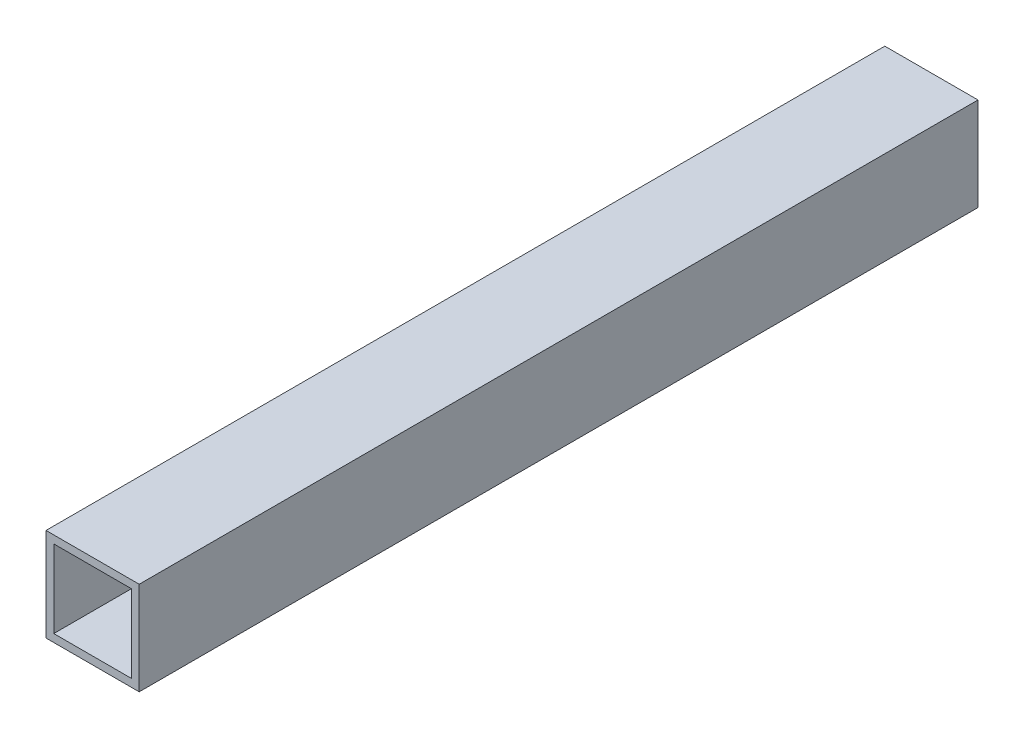
ISO-10303-21;
HEADER;
FILE_DESCRIPTION(('STEP AP214'),'2;1');
FILE_NAME('part.step','',(''),(''),'','','');
FILE_SCHEMA(('AUTOMOTIVE_DESIGN { 1 0 10303 214 1 1 1 1 }'));
ENDSEC;
DATA;
#1=APPLICATION_CONTEXT('core data for automotive mechanical design processes');
#2=APPLICATION_PROTOCOL_DEFINITION('international standard','automotive_design',2000,#1);
#3=PRODUCT_CONTEXT('',#1,'mechanical');
#4=PRODUCT('Part','Part','',(#3));
#5=PRODUCT_RELATED_PRODUCT_CATEGORY('part','',(#4));
#6=PRODUCT_DEFINITION_FORMATION('','',#4);
#7=PRODUCT_DEFINITION_CONTEXT('part definition',#1,'design');
#8=PRODUCT_DEFINITION('design','',#6,#7);
#9=PRODUCT_DEFINITION_SHAPE('','',#8);
#10=(LENGTH_UNIT() NAMED_UNIT(*) SI_UNIT(.MILLI.,.METRE.));
#11=(NAMED_UNIT(*) PLANE_ANGLE_UNIT() SI_UNIT($,.RADIAN.));
#12=(NAMED_UNIT(*) SI_UNIT($,.STERADIAN.) SOLID_ANGLE_UNIT());
#13=UNCERTAINTY_MEASURE_WITH_UNIT(LENGTH_MEASURE(1.E-05),#10,'distance_accuracy_value','');
#14=(GEOMETRIC_REPRESENTATION_CONTEXT(3) GLOBAL_UNCERTAINTY_ASSIGNED_CONTEXT((#13)) GLOBAL_UNIT_ASSIGNED_CONTEXT((#10,
#11,#12)) REPRESENTATION_CONTEXT('',''));
#15=CARTESIAN_POINT('',(0.,0.,0.));
#16=DIRECTION('',(0.,0.,1.));
#17=DIRECTION('',(1.,0.,0.));
#18=AXIS2_PLACEMENT_3D('',#15,#16,#17);
#19=CARTESIAN_POINT('',(0.,0.,108.));
#20=DIRECTION('',(0.,0.,1.));
#21=DIRECTION('',(1.,0.,0.));
#22=AXIS2_PLACEMENT_3D('',#19,#20,#21);
#23=PLANE('',#22);
#24=DIRECTION('',(0.,-1.,0.));
#25=VECTOR('',#24,1.);
#26=CARTESIAN_POINT('',(-12.,12.,108.));
#27=LINE('',#26,#25);
#28=CARTESIAN_POINT('',(-12.,12.,108.));
#29=VERTEX_POINT('',#28);
#30=CARTESIAN_POINT('',(-12.,-12.,108.));
#31=VERTEX_POINT('',#30);
#32=EDGE_CURVE('E136',#29,#31,#27,.T.);
#33=ORIENTED_EDGE('',*,*,#32,.T.);
#34=DIRECTION('',(1.,0.,0.));
#35=VECTOR('',#34,1.);
#36=CARTESIAN_POINT('',(-12.,-12.,108.));
#37=LINE('',#36,#35);
#38=CARTESIAN_POINT('',(12.,-12.,108.));
#39=VERTEX_POINT('',#38);
#40=EDGE_CURVE('E139',#31,#39,#37,.T.);
#41=ORIENTED_EDGE('',*,*,#40,.T.);
#42=DIRECTION('',(0.,1.,0.));
#43=VECTOR('',#42,1.);
#44=CARTESIAN_POINT('',(12.,12.,108.));
#45=LINE('',#44,#43);
#46=CARTESIAN_POINT('',(12.,12.,108.));
#47=VERTEX_POINT('',#46);
#48=EDGE_CURVE('E142',#39,#47,#45,.T.);
#49=ORIENTED_EDGE('',*,*,#48,.T.);
#50=DIRECTION('',(-1.,0.,0.));
#51=VECTOR('',#50,1.);
#52=CARTESIAN_POINT('',(-12.,12.,108.));
#53=LINE('',#52,#51);
#54=EDGE_CURVE('E144',#47,#29,#53,.T.);
#55=ORIENTED_EDGE('',*,*,#54,.T.);
#56=EDGE_LOOP('',(#33,#41,#49,#55));
#57=FACE_BOUND('',#56,.T.);
#58=DIRECTION('',(-1.,0.,0.));
#59=VECTOR('',#58,1.);
#60=CARTESIAN_POINT('',(-10.,10.,108.));
#61=LINE('',#60,#59);
#62=CARTESIAN_POINT('',(10.,10.,108.));
#63=VERTEX_POINT('',#62);
#64=CARTESIAN_POINT('',(-10.,10.,108.));
#65=VERTEX_POINT('',#64);
#66=EDGE_CURVE('E108',#63,#65,#61,.T.);
#67=ORIENTED_EDGE('',*,*,#66,.F.);
#68=DIRECTION('',(0.,1.,0.));
#69=VECTOR('',#68,1.);
#70=CARTESIAN_POINT('',(10.,10.,108.));
#71=LINE('',#70,#69);
#72=CARTESIAN_POINT('',(10.,-10.,108.));
#73=VERTEX_POINT('',#72);
#74=EDGE_CURVE('E100',#73,#63,#71,.T.);
#75=ORIENTED_EDGE('',*,*,#74,.F.);
#76=DIRECTION('',(1.,0.,0.));
#77=VECTOR('',#76,1.);
#78=CARTESIAN_POINT('',(-10.,-10.,108.));
#79=LINE('',#78,#77);
#80=CARTESIAN_POINT('',(-10.,-10.,108.));
#81=VERTEX_POINT('',#80);
#82=EDGE_CURVE('E122',#81,#73,#79,.T.);
#83=ORIENTED_EDGE('',*,*,#82,.F.);
#84=DIRECTION('',(0.,-1.,0.));
#85=VECTOR('',#84,1.);
#86=CARTESIAN_POINT('',(-10.,10.,108.));
#87=LINE('',#86,#85);
#88=EDGE_CURVE('E120',#65,#81,#87,.T.);
#89=ORIENTED_EDGE('',*,*,#88,.F.);
#90=EDGE_LOOP('',(#67,#75,#83,#89));
#91=FACE_BOUND('',#90,.T.);
#92=ADVANCED_FACE('F35',(#57,#91),#23,.T.);
#93=CARTESIAN_POINT('',(0.,0.,-108.));
#94=DIRECTION('',(0.,0.,1.));
#95=DIRECTION('',(1.,0.,0.));
#96=AXIS2_PLACEMENT_3D('',#93,#94,#95);
#97=PLANE('',#96);
#98=DIRECTION('',(0.,-1.,0.));
#99=VECTOR('',#98,1.);
#100=CARTESIAN_POINT('',(-12.,12.,-108.));
#101=LINE('',#100,#99);
#102=CARTESIAN_POINT('',(-12.,12.,-108.));
#103=VERTEX_POINT('',#102);
#104=CARTESIAN_POINT('',(-12.,-12.,-108.));
#105=VERTEX_POINT('',#104);
#106=EDGE_CURVE('E116',#103,#105,#101,.T.);
#107=ORIENTED_EDGE('',*,*,#106,.F.);
#108=DIRECTION('',(-1.,0.,0.));
#109=VECTOR('',#108,1.);
#110=CARTESIAN_POINT('',(-12.,12.,-108.));
#111=LINE('',#110,#109);
#112=CARTESIAN_POINT('',(12.,12.,-108.));
#113=VERTEX_POINT('',#112);
#114=EDGE_CURVE('E140',#113,#103,#111,.T.);
#115=ORIENTED_EDGE('',*,*,#114,.F.);
#116=DIRECTION('',(0.,1.,0.));
#117=VECTOR('',#116,1.);
#118=CARTESIAN_POINT('',(12.,12.,-108.));
#119=LINE('',#118,#117);
#120=CARTESIAN_POINT('',(12.,-12.,-108.));
#121=VERTEX_POINT('',#120);
#122=EDGE_CURVE('E151',#121,#113,#119,.T.);
#123=ORIENTED_EDGE('',*,*,#122,.F.);
#124=DIRECTION('',(1.,0.,0.));
#125=VECTOR('',#124,1.);
#126=CARTESIAN_POINT('',(-12.,-12.,-108.));
#127=LINE('',#126,#125);
#128=EDGE_CURVE('E149',#105,#121,#127,.T.);
#129=ORIENTED_EDGE('',*,*,#128,.F.);
#130=EDGE_LOOP('',(#107,#115,#123,#129));
#131=FACE_BOUND('',#130,.T.);
#132=DIRECTION('',(0.,1.,0.));
#133=VECTOR('',#132,1.);
#134=CARTESIAN_POINT('',(10.,10.,-108.));
#135=LINE('',#134,#133);
#136=CARTESIAN_POINT('',(10.,-10.,-108.));
#137=VERTEX_POINT('',#136);
#138=CARTESIAN_POINT('',(10.,10.,-108.));
#139=VERTEX_POINT('',#138);
#140=EDGE_CURVE('E58',#137,#139,#135,.T.);
#141=ORIENTED_EDGE('',*,*,#140,.T.);
#142=DIRECTION('',(-1.,0.,0.));
#143=VECTOR('',#142,1.);
#144=CARTESIAN_POINT('',(-10.,10.,-108.));
#145=LINE('',#144,#143);
#146=CARTESIAN_POINT('',(-10.,10.,-108.));
#147=VERTEX_POINT('',#146);
#148=EDGE_CURVE('E115',#139,#147,#145,.T.);
#149=ORIENTED_EDGE('',*,*,#148,.T.);
#150=DIRECTION('',(0.,-1.,0.));
#151=VECTOR('',#150,1.);
#152=CARTESIAN_POINT('',(-10.,10.,-108.));
#153=LINE('',#152,#151);
#154=CARTESIAN_POINT('',(-10.,-10.,-108.));
#155=VERTEX_POINT('',#154);
#156=EDGE_CURVE('E128',#147,#155,#153,.T.);
#157=ORIENTED_EDGE('',*,*,#156,.T.);
#158=DIRECTION('',(1.,0.,0.));
#159=VECTOR('',#158,1.);
#160=CARTESIAN_POINT('',(-10.,-10.,-108.));
#161=LINE('',#160,#159);
#162=EDGE_CURVE('E109',#155,#137,#161,.T.);
#163=ORIENTED_EDGE('',*,*,#162,.T.);
#164=EDGE_LOOP('',(#141,#149,#157,#163));
#165=FACE_BOUND('',#164,.T.);
#166=ADVANCED_FACE('F169',(#131,#165),#97,.F.);
#167=CARTESIAN_POINT('',(-12.,12.,108.));
#168=DIRECTION('',(1.,0.,0.));
#169=DIRECTION('',(0.,1.,0.));
#170=AXIS2_PLACEMENT_3D('',#167,#168,#169);
#171=PLANE('',#170);
#172=ORIENTED_EDGE('',*,*,#106,.T.);
#173=DIRECTION('',(0.,0.,-1.));
#174=VECTOR('',#173,1.);
#175=CARTESIAN_POINT('',(-12.,-12.,108.));
#176=LINE('',#175,#174);
#177=EDGE_CURVE('E11',#31,#105,#176,.T.);
#178=ORIENTED_EDGE('',*,*,#177,.F.);
#179=ORIENTED_EDGE('',*,*,#32,.F.);
#180=DIRECTION('',(0.,0.,-1.));
#181=VECTOR('',#180,1.);
#182=CARTESIAN_POINT('',(-12.,12.,108.));
#183=LINE('',#182,#181);
#184=EDGE_CURVE('E146',#29,#103,#183,.T.);
#185=ORIENTED_EDGE('',*,*,#184,.T.);
#186=EDGE_LOOP('',(#172,#178,#179,#185));
#187=FACE_BOUND('',#186,.T.);
#188=ADVANCED_FACE('F37',(#187),#171,.F.);
#189=CARTESIAN_POINT('',(-12.,-12.,108.));
#190=DIRECTION('',(0.,1.,0.));
#191=DIRECTION('',(-1.,0.,0.));
#192=AXIS2_PLACEMENT_3D('',#189,#190,#191);
#193=PLANE('',#192);
#194=ORIENTED_EDGE('',*,*,#128,.T.);
#195=DIRECTION('',(0.,0.,-1.));
#196=VECTOR('',#195,1.);
#197=CARTESIAN_POINT('',(12.,-12.,108.));
#198=LINE('',#197,#196);
#199=EDGE_CURVE('E43',#39,#121,#198,.T.);
#200=ORIENTED_EDGE('',*,*,#199,.F.);
#201=ORIENTED_EDGE('',*,*,#40,.F.);
#202=ORIENTED_EDGE('',*,*,#177,.T.);
#203=EDGE_LOOP('',(#194,#200,#201,#202));
#204=FACE_BOUND('',#203,.T.);
#205=ADVANCED_FACE('F179',(#204),#193,.F.);
#206=CARTESIAN_POINT('',(12.,12.,108.));
#207=DIRECTION('',(-1.,0.,0.));
#208=DIRECTION('',(0.,-1.,0.));
#209=AXIS2_PLACEMENT_3D('',#206,#207,#208);
#210=PLANE('',#209);
#211=ORIENTED_EDGE('',*,*,#122,.T.);
#212=DIRECTION('',(0.,0.,-1.));
#213=VECTOR('',#212,1.);
#214=CARTESIAN_POINT('',(12.,12.,108.));
#215=LINE('',#214,#213);
#216=EDGE_CURVE('E156',#47,#113,#215,.T.);
#217=ORIENTED_EDGE('',*,*,#216,.F.);
#218=ORIENTED_EDGE('',*,*,#48,.F.);
#219=ORIENTED_EDGE('',*,*,#199,.T.);
#220=EDGE_LOOP('',(#211,#217,#218,#219));
#221=FACE_BOUND('',#220,.T.);
#222=ADVANCED_FACE('F163',(#221),#210,.F.);
#223=CARTESIAN_POINT('',(-12.,12.,108.));
#224=DIRECTION('',(0.,-1.,0.));
#225=DIRECTION('',(0.,0.,-1.));
#226=AXIS2_PLACEMENT_3D('',#223,#224,#225);
#227=PLANE('',#226);
#228=ORIENTED_EDGE('',*,*,#114,.T.);
#229=ORIENTED_EDGE('',*,*,#184,.F.);
#230=ORIENTED_EDGE('',*,*,#54,.F.);
#231=ORIENTED_EDGE('',*,*,#216,.T.);
#232=EDGE_LOOP('',(#228,#229,#230,#231));
#233=FACE_BOUND('',#232,.T.);
#234=ADVANCED_FACE('F173',(#233),#227,.F.);
#235=CARTESIAN_POINT('',(10.,10.,108.));
#236=DIRECTION('',(-1.,0.,0.));
#237=DIRECTION('',(0.,0.,1.));
#238=AXIS2_PLACEMENT_3D('',#235,#236,#237);
#239=PLANE('',#238);
#240=ORIENTED_EDGE('',*,*,#140,.F.);
#241=DIRECTION('',(0.,0.,-1.));
#242=VECTOR('',#241,1.);
#243=CARTESIAN_POINT('',(10.,-10.,108.));
#244=LINE('',#243,#242);
#245=EDGE_CURVE('E104',#73,#137,#244,.T.);
#246=ORIENTED_EDGE('',*,*,#245,.F.);
#247=ORIENTED_EDGE('',*,*,#74,.T.);
#248=DIRECTION('',(0.,0.,-1.));
#249=VECTOR('',#248,1.);
#250=CARTESIAN_POINT('',(10.,10.,108.));
#251=LINE('',#250,#249);
#252=EDGE_CURVE('E103',#63,#139,#251,.T.);
#253=ORIENTED_EDGE('',*,*,#252,.T.);
#254=EDGE_LOOP('',(#240,#246,#247,#253));
#255=FACE_BOUND('',#254,.T.);
#256=ADVANCED_FACE('F102',(#255),#239,.T.);
#257=CARTESIAN_POINT('',(-10.,10.,108.));
#258=DIRECTION('',(0.,-1.,0.));
#259=DIRECTION('',(0.,0.,-1.));
#260=AXIS2_PLACEMENT_3D('',#257,#258,#259);
#261=PLANE('',#260);
#262=ORIENTED_EDGE('',*,*,#148,.F.);
#263=ORIENTED_EDGE('',*,*,#252,.F.);
#264=ORIENTED_EDGE('',*,*,#66,.T.);
#265=DIRECTION('',(0.,0.,-1.));
#266=VECTOR('',#265,1.);
#267=CARTESIAN_POINT('',(-10.,10.,108.));
#268=LINE('',#267,#266);
#269=EDGE_CURVE('E117',#65,#147,#268,.T.);
#270=ORIENTED_EDGE('',*,*,#269,.T.);
#271=EDGE_LOOP('',(#262,#263,#264,#270));
#272=FACE_BOUND('',#271,.T.);
#273=ADVANCED_FACE('F112',(#272),#261,.T.);
#274=CARTESIAN_POINT('',(-10.,10.,108.));
#275=DIRECTION('',(1.,0.,0.));
#276=DIRECTION('',(0.,1.,0.));
#277=AXIS2_PLACEMENT_3D('',#274,#275,#276);
#278=PLANE('',#277);
#279=ORIENTED_EDGE('',*,*,#156,.F.);
#280=ORIENTED_EDGE('',*,*,#269,.F.);
#281=ORIENTED_EDGE('',*,*,#88,.T.);
#282=DIRECTION('',(0.,0.,-1.));
#283=VECTOR('',#282,1.);
#284=CARTESIAN_POINT('',(-10.,-10.,108.));
#285=LINE('',#284,#283);
#286=EDGE_CURVE('E50',#81,#155,#285,.T.);
#287=ORIENTED_EDGE('',*,*,#286,.T.);
#288=EDGE_LOOP('',(#279,#280,#281,#287));
#289=FACE_BOUND('',#288,.T.);
#290=ADVANCED_FACE('F202',(#289),#278,.T.);
#291=CARTESIAN_POINT('',(-10.,-10.,108.));
#292=DIRECTION('',(0.,1.,0.));
#293=DIRECTION('',(0.,0.,1.));
#294=AXIS2_PLACEMENT_3D('',#291,#292,#293);
#295=PLANE('',#294);
#296=ORIENTED_EDGE('',*,*,#162,.F.);
#297=ORIENTED_EDGE('',*,*,#286,.F.);
#298=ORIENTED_EDGE('',*,*,#82,.T.);
#299=ORIENTED_EDGE('',*,*,#245,.T.);
#300=EDGE_LOOP('',(#296,#297,#298,#299));
#301=FACE_BOUND('',#300,.T.);
#302=ADVANCED_FACE('F206',(#301),#295,.T.);
#303=CLOSED_SHELL('',(#92,#166,#188,#205,#222,#234,#256,#273,#290,#302));
#304=MANIFOLD_SOLID_BREP('B2',#303);
#305=ADVANCED_BREP_SHAPE_REPRESENTATION('',(#18,#304),#14);
#306=SHAPE_DEFINITION_REPRESENTATION(#9,#305);
ENDSEC;
END-ISO-10303-21;
